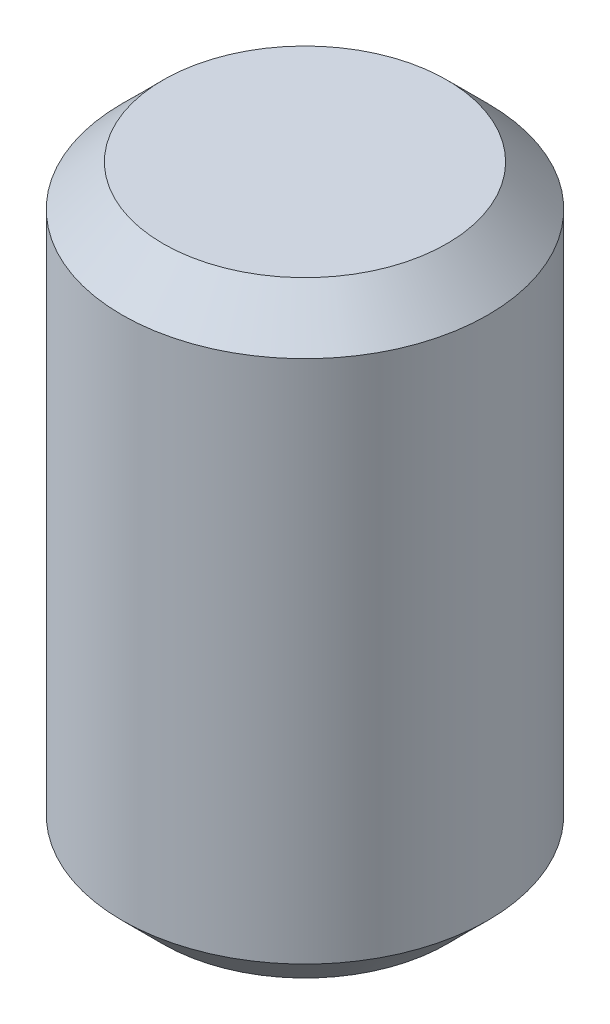
ISO-10303-21;
HEADER;
FILE_DESCRIPTION(('STEP AP214'),'2;1');
FILE_NAME('part.step','',(''),(''),'','','');
FILE_SCHEMA(('AUTOMOTIVE_DESIGN { 1 0 10303 214 1 1 1 1 }'));
ENDSEC;
DATA;
#1=APPLICATION_CONTEXT('core data for automotive mechanical design processes');
#2=APPLICATION_PROTOCOL_DEFINITION('international standard','automotive_design',2000,#1);
#3=PRODUCT_CONTEXT('',#1,'mechanical');
#4=PRODUCT('Part','Part','',(#3));
#5=PRODUCT_RELATED_PRODUCT_CATEGORY('part','',(#4));
#6=PRODUCT_DEFINITION_FORMATION('','',#4);
#7=PRODUCT_DEFINITION_CONTEXT('part definition',#1,'design');
#8=PRODUCT_DEFINITION('design','',#6,#7);
#9=PRODUCT_DEFINITION_SHAPE('','',#8);
#10=(LENGTH_UNIT() NAMED_UNIT(*) SI_UNIT(.MILLI.,.METRE.));
#11=(NAMED_UNIT(*) PLANE_ANGLE_UNIT() SI_UNIT($,.RADIAN.));
#12=(NAMED_UNIT(*) SI_UNIT($,.STERADIAN.) SOLID_ANGLE_UNIT());
#13=UNCERTAINTY_MEASURE_WITH_UNIT(LENGTH_MEASURE(1.E-05),#10,'distance_accuracy_value','');
#14=(GEOMETRIC_REPRESENTATION_CONTEXT(3) GLOBAL_UNCERTAINTY_ASSIGNED_CONTEXT((#13)) GLOBAL_UNIT_ASSIGNED_CONTEXT((#10,
#11,#12)) REPRESENTATION_CONTEXT('',''));
#15=CARTESIAN_POINT('',(0.,0.,0.));
#16=DIRECTION('',(0.,0.,1.));
#17=DIRECTION('',(1.,0.,0.));
#18=AXIS2_PLACEMENT_3D('',#15,#16,#17);
#19=CARTESIAN_POINT('',(0.,0.,0.));
#20=DIRECTION('',(0.,1.,0.));
#21=DIRECTION('',(0.,0.,1.));
#22=AXIS2_PLACEMENT_3D('',#19,#20,#21);
#23=CYLINDRICAL_SURFACE('',#22,0.89);
#24=CARTESIAN_POINT('',(0.,0.199999999989195,0.));
#25=DIRECTION('',(0.,-1.,0.));
#26=DIRECTION('',(0.,0.,-1.));
#27=AXIS2_PLACEMENT_3D('',#24,#25,#26);
#28=CIRCLE('',#27,0.89);
#29=CARTESIAN_POINT('',(0.,0.199999999989195,0.89));
#30=VERTEX_POINT('',#29);
#31=EDGE_CURVE('E178',#30,#30,#28,.F.);
#32=ORIENTED_EDGE('',*,*,#31,.T.);
#33=EDGE_LOOP('',(#32));
#34=FACE_BOUND('',#33,.T.);
#35=CARTESIAN_POINT('',(0.,2.74999999995396,0.));
#36=DIRECTION('',(0.,1.,0.));
#37=DIRECTION('',(0.,0.,1.));
#38=AXIS2_PLACEMENT_3D('',#35,#36,#37);
#39=CIRCLE('',#38,0.89);
#40=CARTESIAN_POINT('',(0.,2.74999999995396,0.89));
#41=VERTEX_POINT('',#40);
#42=EDGE_CURVE('E166',#41,#41,#39,.F.);
#43=ORIENTED_EDGE('',*,*,#42,.T.);
#44=EDGE_LOOP('',(#43));
#45=FACE_BOUND('',#44,.T.);
#46=ADVANCED_FACE('F38',(#34,#45),#23,.T.);
#47=CARTESIAN_POINT('',(0.89,0.,0.));
#48=DIRECTION('',(0.,-1.,0.));
#49=DIRECTION('',(0.,0.,-1.));
#50=AXIS2_PLACEMENT_3D('',#47,#48,#49);
#51=PLANE('',#50);
#52=CARTESIAN_POINT('',(0.,0.,0.));
#53=DIRECTION('',(0.,-1.,0.));
#54=DIRECTION('',(0.,0.,-1.));
#55=AXIS2_PLACEMENT_3D('',#52,#53,#54);
#56=CIRCLE('',#55,0.68999999995396);
#57=CARTESIAN_POINT('',(0.,0.,0.68999999995396));
#58=VERTEX_POINT('',#57);
#59=EDGE_CURVE('E47',#58,#58,#56,.T.);
#60=ORIENTED_EDGE('',*,*,#59,.T.);
#61=EDGE_LOOP('',(#60));
#62=FACE_BOUND('',#61,.T.);
#63=DIRECTION('',(-1.,0.,0.));
#64=VECTOR('',#63,1.);
#65=CARTESIAN_POINT('',(0.234999999999993,0.,0.407031939778696));
#66=LINE('',#65,#64);
#67=CARTESIAN_POINT('',(0.234999999999993,0.,0.407031939778696));
#68=VERTEX_POINT('',#67);
#69=CARTESIAN_POINT('',(-0.235,0.,0.4070319397787));
#70=VERTEX_POINT('',#69);
#71=EDGE_CURVE('E57',#68,#70,#66,.T.);
#72=ORIENTED_EDGE('',*,*,#71,.F.);
#73=DIRECTION('',(-0.50000000000001,0.,0.866025403784433));
#74=VECTOR('',#73,1.);
#75=CARTESIAN_POINT('',(0.470000000000007,0.,0.));
#76=LINE('',#75,#74);
#77=CARTESIAN_POINT('',(0.470000000000007,0.,0.));
#78=VERTEX_POINT('',#77);
#79=EDGE_CURVE('E160',#78,#68,#76,.T.);
#80=ORIENTED_EDGE('',*,*,#79,.F.);
#81=DIRECTION('',(0.500000000000002,0.,0.866025403784437));
#82=VECTOR('',#81,1.);
#83=CARTESIAN_POINT('',(0.235,0.,-0.4070319397787));
#84=LINE('',#83,#82);
#85=CARTESIAN_POINT('',(0.235,0.,-0.4070319397787));
#86=VERTEX_POINT('',#85);
#87=EDGE_CURVE('E157',#86,#78,#84,.T.);
#88=ORIENTED_EDGE('',*,*,#87,.F.);
#89=DIRECTION('',(1.,0.,0.));
#90=VECTOR('',#89,1.);
#91=CARTESIAN_POINT('',(-0.234999999999996,0.,-0.407031939778698));
#92=LINE('',#91,#90);
#93=CARTESIAN_POINT('',(-0.234999999999996,0.,-0.407031939778698));
#94=VERTEX_POINT('',#93);
#95=EDGE_CURVE('E114',#94,#86,#92,.T.);
#96=ORIENTED_EDGE('',*,*,#95,.F.);
#97=DIRECTION('',(0.500000000000002,0.,-0.866025403784437));
#98=VECTOR('',#97,1.);
#99=CARTESIAN_POINT('',(-0.470000000000007,0.,0.));
#100=LINE('',#99,#98);
#101=CARTESIAN_POINT('',(-0.470000000000007,0.,0.));
#102=VERTEX_POINT('',#101);
#103=EDGE_CURVE('E151',#102,#94,#100,.T.);
#104=ORIENTED_EDGE('',*,*,#103,.F.);
#105=DIRECTION('',(-0.500000000000002,0.,-0.866025403784437));
#106=VECTOR('',#105,1.);
#107=CARTESIAN_POINT('',(-0.235,0.,0.4070319397787));
#108=LINE('',#107,#106);
#109=EDGE_CURVE('E147',#70,#102,#108,.T.);
#110=ORIENTED_EDGE('',*,*,#109,.F.);
#111=EDGE_LOOP('',(#72,#80,#88,#96,#104,#110));
#112=FACE_BOUND('',#111,.T.);
#113=ADVANCED_FACE('F185',(#62,#112),#51,.T.);
#114=CARTESIAN_POINT('',(0.,2.95,0.));
#115=DIRECTION('',(0.,1.,0.));
#116=DIRECTION('',(0.,0.,1.));
#117=AXIS2_PLACEMENT_3D('',#114,#115,#116);
#118=PLANE('',#117);
#119=CARTESIAN_POINT('',(0.,2.95,0.));
#120=DIRECTION('',(0.,1.,0.));
#121=DIRECTION('',(0.,0.,1.));
#122=AXIS2_PLACEMENT_3D('',#119,#120,#121);
#123=CIRCLE('',#122,0.690000000010805);
#124=CARTESIAN_POINT('',(0.,2.95,0.690000000010805));
#125=VERTEX_POINT('',#124);
#126=EDGE_CURVE('E11',#125,#125,#123,.T.);
#127=ORIENTED_EDGE('',*,*,#126,.T.);
#128=EDGE_LOOP('',(#127));
#129=FACE_BOUND('',#128,.T.);
#130=ADVANCED_FACE('F202',(#129),#118,.T.);
#131=CARTESIAN_POINT('',(0.234999999999993,0.375,0.407031939778696));
#132=DIRECTION('',(0.,0.,1.));
#133=DIRECTION('',(1.,0.,0.));
#134=AXIS2_PLACEMENT_3D('',#131,#132,#133);
#135=PLANE('',#134);
#136=ORIENTED_EDGE('',*,*,#71,.T.);
#137=DIRECTION('',(0.,-1.,0.));
#138=VECTOR('',#137,1.);
#139=CARTESIAN_POINT('',(-0.235,0.375,0.4070319397787));
#140=LINE('',#139,#138);
#141=CARTESIAN_POINT('',(-0.235,0.375,0.4070319397787));
#142=VERTEX_POINT('',#141);
#143=EDGE_CURVE('E93',#142,#70,#140,.T.);
#144=ORIENTED_EDGE('',*,*,#143,.F.);
#145=DIRECTION('',(-1.,0.,0.));
#146=VECTOR('',#145,1.);
#147=CARTESIAN_POINT('',(0.234999999999993,0.375,0.407031939778696));
#148=LINE('',#147,#146);
#149=CARTESIAN_POINT('',(0.234999999999993,0.375,0.407031939778696));
#150=VERTEX_POINT('',#149);
#151=EDGE_CURVE('E163',#150,#142,#148,.T.);
#152=ORIENTED_EDGE('',*,*,#151,.F.);
#153=DIRECTION('',(0.,-1.,0.));
#154=VECTOR('',#153,1.);
#155=CARTESIAN_POINT('',(0.234999999999993,0.375,0.407031939778696));
#156=LINE('',#155,#154);
#157=EDGE_CURVE('E68',#150,#68,#156,.T.);
#158=ORIENTED_EDGE('',*,*,#157,.T.);
#159=EDGE_LOOP('',(#136,#144,#152,#158));
#160=FACE_BOUND('',#159,.T.);
#161=ADVANCED_FACE('F204',(#160),#135,.F.);
#162=CARTESIAN_POINT('',(0.470000000000007,0.375,0.));
#163=DIRECTION('',(0.866025403784433,0.,0.500000000000009));
#164=DIRECTION('',(0.50000000000001,0.,-0.866025403784433));
#165=AXIS2_PLACEMENT_3D('',#162,#163,#164);
#166=PLANE('',#165);
#167=ORIENTED_EDGE('',*,*,#79,.T.);
#168=ORIENTED_EDGE('',*,*,#157,.F.);
#169=DIRECTION('',(-0.50000000000001,0.,0.866025403784433));
#170=VECTOR('',#169,1.);
#171=CARTESIAN_POINT('',(0.470000000000007,0.375,0.));
#172=LINE('',#171,#170);
#173=CARTESIAN_POINT('',(0.470000000000007,0.375,0.));
#174=VERTEX_POINT('',#173);
#175=EDGE_CURVE('E128',#174,#150,#172,.T.);
#176=ORIENTED_EDGE('',*,*,#175,.F.);
#177=DIRECTION('',(0.,-1.,0.));
#178=VECTOR('',#177,1.);
#179=CARTESIAN_POINT('',(0.470000000000007,0.375,0.));
#180=LINE('',#179,#178);
#181=EDGE_CURVE('E119',#174,#78,#180,.T.);
#182=ORIENTED_EDGE('',*,*,#181,.T.);
#183=EDGE_LOOP('',(#167,#168,#176,#182));
#184=FACE_BOUND('',#183,.T.);
#185=ADVANCED_FACE('F210',(#184),#166,.F.);
#186=CARTESIAN_POINT('',(0.235,0.375,-0.4070319397787));
#187=DIRECTION('',(0.866025403784437,0.,-0.500000000000002));
#188=DIRECTION('',(-0.500000000000002,0.,-0.866025403784438));
#189=AXIS2_PLACEMENT_3D('',#186,#187,#188);
#190=PLANE('',#189);
#191=ORIENTED_EDGE('',*,*,#87,.T.);
#192=ORIENTED_EDGE('',*,*,#181,.F.);
#193=DIRECTION('',(0.500000000000002,0.,0.866025403784437));
#194=VECTOR('',#193,1.);
#195=CARTESIAN_POINT('',(0.235,0.375,-0.4070319397787));
#196=LINE('',#195,#194);
#197=CARTESIAN_POINT('',(0.235,0.375,-0.4070319397787));
#198=VERTEX_POINT('',#197);
#199=EDGE_CURVE('E123',#198,#174,#196,.T.);
#200=ORIENTED_EDGE('',*,*,#199,.F.);
#201=DIRECTION('',(0.,-1.,0.));
#202=VECTOR('',#201,1.);
#203=CARTESIAN_POINT('',(0.235,0.375,-0.4070319397787));
#204=LINE('',#203,#202);
#205=EDGE_CURVE('E107',#198,#86,#204,.T.);
#206=ORIENTED_EDGE('',*,*,#205,.T.);
#207=EDGE_LOOP('',(#191,#192,#200,#206));
#208=FACE_BOUND('',#207,.T.);
#209=ADVANCED_FACE('F124',(#208),#190,.F.);
#210=CARTESIAN_POINT('',(-0.234999999999996,0.375,-0.407031939778698));
#211=DIRECTION('',(0.,0.,-1.));
#212=DIRECTION('',(-1.,0.,0.));
#213=AXIS2_PLACEMENT_3D('',#210,#211,#212);
#214=PLANE('',#213);
#215=ORIENTED_EDGE('',*,*,#95,.T.);
#216=ORIENTED_EDGE('',*,*,#205,.F.);
#217=DIRECTION('',(1.,0.,0.));
#218=VECTOR('',#217,1.);
#219=CARTESIAN_POINT('',(-0.234999999999996,0.375,-0.407031939778698));
#220=LINE('',#219,#218);
#221=CARTESIAN_POINT('',(-0.234999999999996,0.375,-0.407031939778698));
#222=VERTEX_POINT('',#221);
#223=EDGE_CURVE('E111',#222,#198,#220,.T.);
#224=ORIENTED_EDGE('',*,*,#223,.F.);
#225=DIRECTION('',(0.,-1.,0.));
#226=VECTOR('',#225,1.);
#227=CARTESIAN_POINT('',(-0.234999999999996,0.375,-0.407031939778698));
#228=LINE('',#227,#226);
#229=EDGE_CURVE('E120',#222,#94,#228,.T.);
#230=ORIENTED_EDGE('',*,*,#229,.T.);
#231=EDGE_LOOP('',(#215,#216,#224,#230));
#232=FACE_BOUND('',#231,.T.);
#233=ADVANCED_FACE('F109',(#232),#214,.F.);
#234=CARTESIAN_POINT('',(-0.470000000000007,0.375,0.));
#235=DIRECTION('',(-0.866025403784437,0.,-0.500000000000002));
#236=DIRECTION('',(-0.500000000000002,0.,0.866025403784438));
#237=AXIS2_PLACEMENT_3D('',#234,#235,#236);
#238=PLANE('',#237);
#239=ORIENTED_EDGE('',*,*,#103,.T.);
#240=ORIENTED_EDGE('',*,*,#229,.F.);
#241=DIRECTION('',(0.500000000000002,0.,-0.866025403784437));
#242=VECTOR('',#241,1.);
#243=CARTESIAN_POINT('',(-0.470000000000007,0.375,0.));
#244=LINE('',#243,#242);
#245=CARTESIAN_POINT('',(-0.470000000000007,0.375,0.));
#246=VERTEX_POINT('',#245);
#247=EDGE_CURVE('E134',#246,#222,#244,.T.);
#248=ORIENTED_EDGE('',*,*,#247,.F.);
#249=DIRECTION('',(0.,-1.,0.));
#250=VECTOR('',#249,1.);
#251=CARTESIAN_POINT('',(-0.470000000000007,0.375,0.));
#252=LINE('',#251,#250);
#253=EDGE_CURVE('E170',#246,#102,#252,.T.);
#254=ORIENTED_EDGE('',*,*,#253,.T.);
#255=EDGE_LOOP('',(#239,#240,#248,#254));
#256=FACE_BOUND('',#255,.T.);
#257=ADVANCED_FACE('F217',(#256),#238,.F.);
#258=CARTESIAN_POINT('',(-0.235,0.375,0.4070319397787));
#259=DIRECTION('',(-0.866025403784437,0.,0.500000000000002));
#260=DIRECTION('',(0.500000000000002,0.,0.866025403784438));
#261=AXIS2_PLACEMENT_3D('',#258,#259,#260);
#262=PLANE('',#261);
#263=ORIENTED_EDGE('',*,*,#109,.T.);
#264=ORIENTED_EDGE('',*,*,#253,.F.);
#265=DIRECTION('',(-0.500000000000002,0.,-0.866025403784437));
#266=VECTOR('',#265,1.);
#267=CARTESIAN_POINT('',(-0.235,0.375,0.4070319397787));
#268=LINE('',#267,#266);
#269=EDGE_CURVE('E139',#142,#246,#268,.T.);
#270=ORIENTED_EDGE('',*,*,#269,.F.);
#271=ORIENTED_EDGE('',*,*,#143,.T.);
#272=EDGE_LOOP('',(#263,#264,#270,#271));
#273=FACE_BOUND('',#272,.T.);
#274=ADVANCED_FACE('F214',(#273),#262,.F.);
#275=CARTESIAN_POINT('',(0.,0.375,0.));
#276=DIRECTION('',(0.,-1.,0.));
#277=DIRECTION('',(0.,0.,-1.));
#278=AXIS2_PLACEMENT_3D('',#275,#276,#277);
#279=PLANE('',#278);
#280=ORIENTED_EDGE('',*,*,#151,.T.);
#281=ORIENTED_EDGE('',*,*,#269,.T.);
#282=ORIENTED_EDGE('',*,*,#247,.T.);
#283=ORIENTED_EDGE('',*,*,#223,.T.);
#284=ORIENTED_EDGE('',*,*,#199,.T.);
#285=ORIENTED_EDGE('',*,*,#175,.T.);
#286=EDGE_LOOP('',(#280,#281,#282,#283,#284,#285));
#287=FACE_BOUND('',#286,.T.);
#288=ADVANCED_FACE('F131',(#287),#279,.T.);
#289=CARTESIAN_POINT('',(0.,0.199999999989195,0.));
#290=DIRECTION('',(0.,1.,0.));
#291=DIRECTION('',(0.,0.,1.));
#292=AXIS2_PLACEMENT_3D('',#289,#290,#291);
#293=CONICAL_SURFACE('',#292,0.89,0.78539816353956);
#294=CARTESIAN_POINT('',(0.,0.,0.68999999995396));
#295=CARTESIAN_POINT('',(0.,0.00208333333322084,0.692083333287773));
#296=CARTESIAN_POINT('',(0.,0.00416666666644161,0.694166666621586));
#297=CARTESIAN_POINT('',(0.,0.00833333333288315,0.698333333289212));
#298=CARTESIAN_POINT('',(0.,0.0104166666661039,0.700416666623025));
#299=CARTESIAN_POINT('',(0.,0.0145833333325455,0.70458333329065));
#300=CARTESIAN_POINT('',(0.,0.0166666666657663,0.706666666624463));
#301=CARTESIAN_POINT('',(0.,0.0208333333322079,0.710833333292089));
#302=CARTESIAN_POINT('',(0.,0.0229166666654286,0.712916666625902));
#303=CARTESIAN_POINT('',(0.,0.0270833333318702,0.717083333293528));
#304=CARTESIAN_POINT('',(0.,0.029166666665091,0.719166666627341));
#305=CARTESIAN_POINT('',(0.,0.0333333333315326,0.723333333294967));
#306=CARTESIAN_POINT('',(0.,0.0354166666647533,0.72541666662878));
#307=CARTESIAN_POINT('',(0.,0.0395833333311949,0.729583333296405));
#308=CARTESIAN_POINT('',(0.,0.0416666666644157,0.731666666630218));
#309=CARTESIAN_POINT('',(0.,0.0458333333308573,0.735833333297844));
#310=CARTESIAN_POINT('',(0.,0.047916666664078,0.737916666631657));
#311=CARTESIAN_POINT('',(0.,0.0520833333305196,0.742083333299283));
#312=CARTESIAN_POINT('',(0.,0.0541666666637404,0.744166666633096));
#313=CARTESIAN_POINT('',(0.,0.0583333333301819,0.748333333300722));
#314=CARTESIAN_POINT('',(0.,0.0604166666634027,0.750416666634535));
#315=CARTESIAN_POINT('',(0.,0.0645833333298443,0.75458333330216));
#316=CARTESIAN_POINT('',(0.,0.0666666666630651,0.756666666635973));
#317=CARTESIAN_POINT('',(0.,0.0708333333295066,0.760833333303599));
#318=CARTESIAN_POINT('',(0.,0.0729166666627274,0.762916666637412));
#319=CARTESIAN_POINT('',(0.,0.077083333329169,0.767083333305038));
#320=CARTESIAN_POINT('',(0.,0.0791666666623898,0.769166666638851));
#321=CARTESIAN_POINT('',(0.,0.0833333333288313,0.773333333306477));
#322=CARTESIAN_POINT('',(0.,0.0854166666620521,0.77541666664029));
#323=CARTESIAN_POINT('',(0.,0.0895833333284937,0.779583333307916));
#324=CARTESIAN_POINT('',(0.,0.0916666666617145,0.781666666641728));
#325=CARTESIAN_POINT('',(0.,0.095833333328156,0.785833333309354));
#326=CARTESIAN_POINT('',(0.,0.0979166666613768,0.787916666643167));
#327=CARTESIAN_POINT('',(0.,0.102083333327818,0.792083333310793));
#328=CARTESIAN_POINT('',(0.,0.104166666661039,0.794166666644606));
#329=CARTESIAN_POINT('',(0.,0.108333333327481,0.798333333312232));
#330=CARTESIAN_POINT('',(0.,0.110416666660702,0.800416666646045));
#331=CARTESIAN_POINT('',(0.,0.114583333327143,0.80458333331367));
#332=CARTESIAN_POINT('',(0.,0.116666666660364,0.806666666647483));
#333=CARTESIAN_POINT('',(0.,0.120833333326805,0.810833333315109));
#334=CARTESIAN_POINT('',(0.,0.122916666660026,0.812916666648922));
#335=CARTESIAN_POINT('',(0.,0.127083333326468,0.817083333316548));
#336=CARTESIAN_POINT('',(0.,0.129166666659689,0.819166666650361));
#337=CARTESIAN_POINT('',(0.,0.13333333332613,0.823333333317987));
#338=CARTESIAN_POINT('',(0.,0.135416666659351,0.8254166666518));
#339=CARTESIAN_POINT('',(0.,0.139583333325792,0.829583333319425));
#340=CARTESIAN_POINT('',(0.,0.141666666659013,0.831666666653238));
#341=CARTESIAN_POINT('',(0.,0.145833333325455,0.835833333320864));
#342=CARTESIAN_POINT('',(0.,0.147916666658676,0.837916666654677));
#343=CARTESIAN_POINT('',(0.,0.152083333325117,0.842083333322303));
#344=CARTESIAN_POINT('',(0.,0.154166666658338,0.844166666656116));
#345=CARTESIAN_POINT('',(0.,0.158333333324779,0.848333333323742));
#346=CARTESIAN_POINT('',(0.,0.160416666658,0.850416666657555));
#347=CARTESIAN_POINT('',(0.,0.164583333324442,0.854583333325181));
#348=CARTESIAN_POINT('',(0.,0.166666666657663,0.856666666658993));
#349=CARTESIAN_POINT('',(0.,0.170833333324104,0.860833333326619));
#350=CARTESIAN_POINT('',(0.,0.172916666657325,0.862916666660432));
#351=CARTESIAN_POINT('',(0.,0.177083333323767,0.867083333328058));
#352=CARTESIAN_POINT('',(0.,0.179166666656987,0.869166666661871));
#353=CARTESIAN_POINT('',(0.,0.183333333323429,0.873333333329497));
#354=CARTESIAN_POINT('',(0.,0.18541666665665,0.87541666666331));
#355=CARTESIAN_POINT('',(0.,0.189583333323091,0.879583333330936));
#356=CARTESIAN_POINT('',(0.,0.191666666656312,0.881666666664748));
#357=CARTESIAN_POINT('',(0.,0.195833333322754,0.885833333332374));
#358=CARTESIAN_POINT('',(0.,0.197916666655974,0.887916666666187));
#359=CARTESIAN_POINT('',(0.,0.199999999989195,0.89));
#360=B_SPLINE_CURVE_WITH_KNOTS('',3,(#294,#295,#296,#297,#298,#299,#300,#301,#302,#303,#304,
#305,#306,#307,#308,#309,#310,#311,#312,#313,#314,#315,#316,#317,#318,#319,#320,#321,#322,#323,
#324,#325,#326,#327,#328,#329,#330,#331,#332,#333,#334,#335,#336,#337,#338,#339,#340,#341,#342,
#343,#344,#345,#346,#347,#348,#349,#350,#351,#352,#353,#354,#355,#356,#357,#358,#359),
.UNSPECIFIED.,.F.,.F.,(4,2,2,2,2,2,2,2,2,2,2,2,2,2,2,2,2,2,2,2,2,2,2,2,2,2,2,2,2,2,2,2,4),(0.,
0.0088388347656104,0.0176776695312209,0.0265165042968313,0.0353553390624418,0.0441941738280522,
0.0530330085936627,0.061871843359273,0.0707106781248835,0.0795495128904939,0.0883883476561043,
0.0972271824217148,0.106066017187325,0.114904851952936,0.123743686718546,0.132582521484157,
0.141421356249767,0.150260191015377,0.159099025780988,0.167937860546598,0.176776695312209,
0.185615530077819,0.19445436484343,0.20329319960904,0.21213203437465,0.220970869140261,
0.229809703905871,0.238648538671482,0.247487373437092,0.256326208202703,0.265165042968313,
0.274003877733924,0.282842712499534),.UNSPECIFIED.);
#361=EDGE_CURVE('BSEAM188',#58,#30,#360,.T.);
#362=ORIENTED_EDGE('',*,*,#59,.F.);
#363=ORIENTED_EDGE('',*,*,#31,.F.);
#364=ORIENTED_EDGE('',*,*,#361,.T.);
#365=ORIENTED_EDGE('',*,*,#361,.F.);
#366=EDGE_LOOP('',(#362,#364,#363,#365));
#367=FACE_BOUND('',#366,.T.);
#368=ADVANCED_FACE('F188',(#367),#293,.T.);
#369=CARTESIAN_POINT('',(0.,2.95,0.));
#370=DIRECTION('',(0.,-1.,0.));
#371=DIRECTION('',(0.,0.,-1.));
#372=AXIS2_PLACEMENT_3D('',#369,#370,#371);
#373=CONICAL_SURFACE('',#372,0.690000000010805,0.785398163255337);
#374=ORIENTED_EDGE('',*,*,#42,.F.);
#375=EDGE_LOOP('',(#374));
#376=FACE_BOUND('',#375,.T.);
#377=ORIENTED_EDGE('',*,*,#126,.F.);
#378=EDGE_LOOP('',(#377));
#379=FACE_BOUND('',#378,.T.);
#380=ADVANCED_FACE('F40',(#376,#379),#373,.T.);
#381=CLOSED_SHELL('',(#46,#113,#130,#161,#185,#209,#233,#257,#274,#288,#368,#380));
#382=MANIFOLD_SOLID_BREP('B2',#381);
#383=ADVANCED_BREP_SHAPE_REPRESENTATION('',(#18,#382),#14);
#384=SHAPE_DEFINITION_REPRESENTATION(#9,#383);
ENDSEC;
END-ISO-10303-21;
